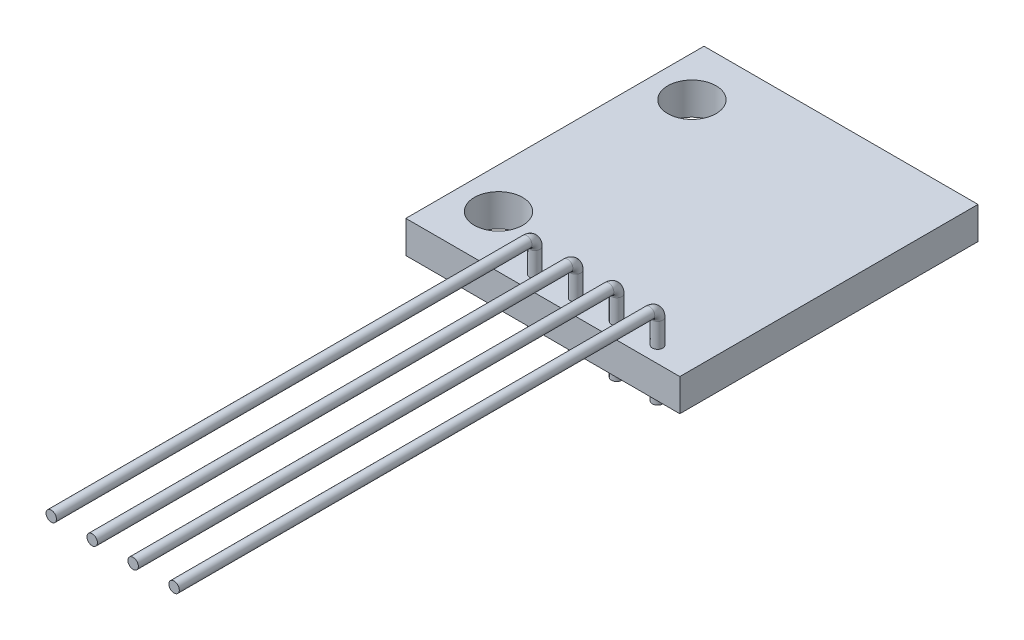
ISO-10303-21;
HEADER;
FILE_DESCRIPTION(('STEP AP214'),'2;1');
FILE_NAME('part.step','',(''),(''),'','','');
FILE_SCHEMA(('AUTOMOTIVE_DESIGN { 1 0 10303 214 1 1 1 1 }'));
ENDSEC;
DATA;
#1=APPLICATION_CONTEXT('core data for automotive mechanical design processes');
#2=APPLICATION_PROTOCOL_DEFINITION('international standard','automotive_design',2000,#1);
#3=PRODUCT_CONTEXT('',#1,'mechanical');
#4=PRODUCT('Part','Part','',(#3));
#5=PRODUCT_RELATED_PRODUCT_CATEGORY('part','',(#4));
#6=PRODUCT_DEFINITION_FORMATION('','',#4);
#7=PRODUCT_DEFINITION_CONTEXT('part definition',#1,'design');
#8=PRODUCT_DEFINITION('design','',#6,#7);
#9=PRODUCT_DEFINITION_SHAPE('','',#8);
#10=(LENGTH_UNIT() NAMED_UNIT(*) SI_UNIT(.MILLI.,.METRE.));
#11=(NAMED_UNIT(*) PLANE_ANGLE_UNIT() SI_UNIT($,.RADIAN.));
#12=(NAMED_UNIT(*) SI_UNIT($,.STERADIAN.) SOLID_ANGLE_UNIT());
#13=UNCERTAINTY_MEASURE_WITH_UNIT(LENGTH_MEASURE(1.E-05),#10,'distance_accuracy_value','');
#14=(GEOMETRIC_REPRESENTATION_CONTEXT(3) GLOBAL_UNCERTAINTY_ASSIGNED_CONTEXT((#13)) GLOBAL_UNIT_ASSIGNED_CONTEXT((#10,
#11,#12)) REPRESENTATION_CONTEXT('',''));
#15=CARTESIAN_POINT('',(0.,0.,0.));
#16=DIRECTION('',(0.,0.,1.));
#17=DIRECTION('',(1.,0.,0.));
#18=AXIS2_PLACEMENT_3D('',#15,#16,#17);
#19=CARTESIAN_POINT('',(0.,2.,0.));
#20=DIRECTION('',(0.,-1.,0.));
#21=DIRECTION('',(0.,0.,-1.));
#22=AXIS2_PLACEMENT_3D('',#19,#20,#21);
#23=PLANE('',#22);
#24=CARTESIAN_POINT('',(14.62,2.,-1.));
#25=DIRECTION('',(0.,-1.,0.));
#26=DIRECTION('',(0.,0.,-1.));
#27=AXIS2_PLACEMENT_3D('',#24,#25,#26);
#28=CIRCLE('',#27,0.325);
#29=CARTESIAN_POINT('',(14.62,2.,-1.325));
#30=VERTEX_POINT('',#29);
#31=EDGE_CURVE('E11',#30,#30,#28,.F.);
#32=ORIENTED_EDGE('',*,*,#31,.F.);
#33=EDGE_LOOP('',(#32));
#34=FACE_BOUND('',#33,.T.);
#35=CARTESIAN_POINT('',(12.08,2.,-1.));
#36=DIRECTION('',(0.,-1.,0.));
#37=DIRECTION('',(0.,0.,-1.));
#38=AXIS2_PLACEMENT_3D('',#35,#36,#37);
#39=CIRCLE('',#38,0.325);
#40=CARTESIAN_POINT('',(12.08,2.,-1.325));
#41=VERTEX_POINT('',#40);
#42=EDGE_CURVE('E43',#41,#41,#39,.F.);
#43=ORIENTED_EDGE('',*,*,#42,.F.);
#44=EDGE_LOOP('',(#43));
#45=FACE_BOUND('',#44,.T.);
#46=CARTESIAN_POINT('',(9.54,2.,-1.));
#47=DIRECTION('',(0.,-1.,0.));
#48=DIRECTION('',(0.,0.,-1.));
#49=AXIS2_PLACEMENT_3D('',#46,#47,#48);
#50=CIRCLE('',#49,0.325);
#51=CARTESIAN_POINT('',(9.54,2.,-1.325));
#52=VERTEX_POINT('',#51);
#53=EDGE_CURVE('E135',#52,#52,#50,.F.);
#54=ORIENTED_EDGE('',*,*,#53,.F.);
#55=EDGE_LOOP('',(#54));
#56=FACE_BOUND('',#55,.T.);
#57=CARTESIAN_POINT('',(7.,2.,-1.));
#58=DIRECTION('',(0.,-1.,0.));
#59=DIRECTION('',(0.,0.,-1.));
#60=AXIS2_PLACEMENT_3D('',#57,#58,#59);
#61=CIRCLE('',#60,0.325);
#62=CARTESIAN_POINT('',(7.,2.,-1.325));
#63=VERTEX_POINT('',#62);
#64=EDGE_CURVE('E150',#63,#63,#61,.F.);
#65=ORIENTED_EDGE('',*,*,#64,.F.);
#66=EDGE_LOOP('',(#65));
#67=FACE_BOUND('',#66,.T.);
#68=DIRECTION('',(0.,0.,1.));
#69=VECTOR('',#68,1.);
#70=CARTESIAN_POINT('',(0.,2.,0.));
#71=LINE('',#70,#69);
#72=CARTESIAN_POINT('',(0.,2.,-18.5));
#73=VERTEX_POINT('',#72);
#74=CARTESIAN_POINT('',(0.,2.,0.));
#75=VERTEX_POINT('',#74);
#76=EDGE_CURVE('E179',#73,#75,#71,.T.);
#77=ORIENTED_EDGE('',*,*,#76,.T.);
#78=DIRECTION('',(1.,0.,0.));
#79=VECTOR('',#78,1.);
#80=CARTESIAN_POINT('',(0.,2.,0.));
#81=LINE('',#80,#79);
#82=CARTESIAN_POINT('',(17.,2.,0.));
#83=VERTEX_POINT('',#82);
#84=EDGE_CURVE('E84',#75,#83,#81,.T.);
#85=ORIENTED_EDGE('',*,*,#84,.T.);
#86=DIRECTION('',(0.,0.,-1.));
#87=VECTOR('',#86,1.);
#88=CARTESIAN_POINT('',(17.,2.,0.));
#89=LINE('',#88,#87);
#90=CARTESIAN_POINT('',(17.,2.,-18.5));
#91=VERTEX_POINT('',#90);
#92=EDGE_CURVE('E182',#83,#91,#89,.T.);
#93=ORIENTED_EDGE('',*,*,#92,.T.);
#94=DIRECTION('',(-1.,0.,0.));
#95=VECTOR('',#94,1.);
#96=CARTESIAN_POINT('',(0.,2.,-18.5));
#97=LINE('',#96,#95);
#98=EDGE_CURVE('E52',#91,#73,#97,.T.);
#99=ORIENTED_EDGE('',*,*,#98,.T.);
#100=EDGE_LOOP('',(#77,#85,#93,#99));
#101=FACE_BOUND('',#100,.T.);
#102=CARTESIAN_POINT('',(2.5,2.,-15.25));
#103=DIRECTION('',(0.,1.,0.));
#104=DIRECTION('',(0.,0.,1.));
#105=AXIS2_PLACEMENT_3D('',#102,#103,#104);
#106=CIRCLE('',#105,1.5);
#107=CARTESIAN_POINT('',(2.5,2.,-13.75));
#108=VERTEX_POINT('',#107);
#109=EDGE_CURVE('E173',#108,#108,#106,.T.);
#110=ORIENTED_EDGE('',*,*,#109,.F.);
#111=EDGE_LOOP('',(#110));
#112=FACE_BOUND('',#111,.T.);
#113=CARTESIAN_POINT('',(2.5,2.,-3.25));
#114=DIRECTION('',(0.,1.,0.));
#115=DIRECTION('',(0.,0.,1.));
#116=AXIS2_PLACEMENT_3D('',#113,#114,#115);
#117=CIRCLE('',#116,1.5);
#118=CARTESIAN_POINT('',(2.5,2.,-1.75));
#119=VERTEX_POINT('',#118);
#120=EDGE_CURVE('E166',#119,#119,#117,.T.);
#121=ORIENTED_EDGE('',*,*,#120,.F.);
#122=EDGE_LOOP('',(#121));
#123=FACE_BOUND('',#122,.T.);
#124=ADVANCED_FACE('F33',(#34,#45,#56,#67,#101,#112,#123),#23,.F.);
#125=CARTESIAN_POINT('',(0.,0.,0.));
#126=DIRECTION('',(0.,-1.,0.));
#127=DIRECTION('',(0.,0.,-1.));
#128=AXIS2_PLACEMENT_3D('',#125,#126,#127);
#129=PLANE('',#128);
#130=CARTESIAN_POINT('',(14.62,0.,-1.));
#131=DIRECTION('',(0.,-1.,0.));
#132=DIRECTION('',(0.,0.,-1.));
#133=AXIS2_PLACEMENT_3D('',#130,#131,#132);
#134=CIRCLE('',#133,0.325);
#135=CARTESIAN_POINT('',(14.62,0.,-1.325));
#136=VERTEX_POINT('',#135);
#137=EDGE_CURVE('E37',#136,#136,#134,.F.);
#138=ORIENTED_EDGE('',*,*,#137,.T.);
#139=EDGE_LOOP('',(#138));
#140=FACE_BOUND('',#139,.T.);
#141=CARTESIAN_POINT('',(12.08,0.,-1.));
#142=DIRECTION('',(0.,-1.,0.));
#143=DIRECTION('',(0.,0.,-1.));
#144=AXIS2_PLACEMENT_3D('',#141,#142,#143);
#145=CIRCLE('',#144,0.325);
#146=CARTESIAN_POINT('',(12.08,0.,-1.325));
#147=VERTEX_POINT('',#146);
#148=EDGE_CURVE('E132',#147,#147,#145,.F.);
#149=ORIENTED_EDGE('',*,*,#148,.T.);
#150=EDGE_LOOP('',(#149));
#151=FACE_BOUND('',#150,.T.);
#152=CARTESIAN_POINT('',(9.54,0.,-1.));
#153=DIRECTION('',(0.,-1.,0.));
#154=DIRECTION('',(0.,0.,-1.));
#155=AXIS2_PLACEMENT_3D('',#152,#153,#154);
#156=CIRCLE('',#155,0.325);
#157=CARTESIAN_POINT('',(9.54,0.,-1.325));
#158=VERTEX_POINT('',#157);
#159=EDGE_CURVE('E147',#158,#158,#156,.F.);
#160=ORIENTED_EDGE('',*,*,#159,.T.);
#161=EDGE_LOOP('',(#160));
#162=FACE_BOUND('',#161,.T.);
#163=CARTESIAN_POINT('',(7.,0.,-1.));
#164=DIRECTION('',(0.,-1.,0.));
#165=DIRECTION('',(0.,0.,-1.));
#166=AXIS2_PLACEMENT_3D('',#163,#164,#165);
#167=CIRCLE('',#166,0.325);
#168=CARTESIAN_POINT('',(7.,0.,-1.325));
#169=VERTEX_POINT('',#168);
#170=EDGE_CURVE('E162',#169,#169,#167,.F.);
#171=ORIENTED_EDGE('',*,*,#170,.T.);
#172=EDGE_LOOP('',(#171));
#173=FACE_BOUND('',#172,.T.);
#174=CARTESIAN_POINT('',(2.5,0.,-15.25));
#175=DIRECTION('',(0.,1.,0.));
#176=DIRECTION('',(0.,0.,1.));
#177=AXIS2_PLACEMENT_3D('',#174,#175,#176);
#178=CIRCLE('',#177,1.5);
#179=CARTESIAN_POINT('',(2.5,0.,-13.75));
#180=VERTEX_POINT('',#179);
#181=EDGE_CURVE('E169',#180,#180,#178,.T.);
#182=ORIENTED_EDGE('',*,*,#181,.T.);
#183=EDGE_LOOP('',(#182));
#184=FACE_BOUND('',#183,.T.);
#185=DIRECTION('',(0.,0.,1.));
#186=VECTOR('',#185,1.);
#187=CARTESIAN_POINT('',(0.,0.,0.));
#188=LINE('',#187,#186);
#189=CARTESIAN_POINT('',(0.,0.,-18.5));
#190=VERTEX_POINT('',#189);
#191=CARTESIAN_POINT('',(0.,0.,0.));
#192=VERTEX_POINT('',#191);
#193=EDGE_CURVE('E176',#190,#192,#188,.T.);
#194=ORIENTED_EDGE('',*,*,#193,.F.);
#195=DIRECTION('',(-1.,0.,0.));
#196=VECTOR('',#195,1.);
#197=CARTESIAN_POINT('',(0.,0.,-18.5));
#198=LINE('',#197,#196);
#199=CARTESIAN_POINT('',(17.,0.,-18.5));
#200=VERTEX_POINT('',#199);
#201=EDGE_CURVE('E76',#200,#190,#198,.T.);
#202=ORIENTED_EDGE('',*,*,#201,.F.);
#203=DIRECTION('',(0.,0.,-1.));
#204=VECTOR('',#203,1.);
#205=CARTESIAN_POINT('',(17.,0.,0.));
#206=LINE('',#205,#204);
#207=CARTESIAN_POINT('',(17.,0.,0.));
#208=VERTEX_POINT('',#207);
#209=EDGE_CURVE('E70',#208,#200,#206,.T.);
#210=ORIENTED_EDGE('',*,*,#209,.F.);
#211=DIRECTION('',(1.,0.,0.));
#212=VECTOR('',#211,1.);
#213=CARTESIAN_POINT('',(0.,0.,0.));
#214=LINE('',#213,#212);
#215=EDGE_CURVE('E188',#192,#208,#214,.T.);
#216=ORIENTED_EDGE('',*,*,#215,.F.);
#217=EDGE_LOOP('',(#194,#202,#210,#216));
#218=FACE_BOUND('',#217,.T.);
#219=CARTESIAN_POINT('',(2.5,0.,-3.25));
#220=DIRECTION('',(0.,1.,0.));
#221=DIRECTION('',(0.,0.,1.));
#222=AXIS2_PLACEMENT_3D('',#219,#220,#221);
#223=CIRCLE('',#222,1.5);
#224=CARTESIAN_POINT('',(2.5,0.,-1.75));
#225=VERTEX_POINT('',#224);
#226=EDGE_CURVE('E170',#225,#225,#223,.T.);
#227=ORIENTED_EDGE('',*,*,#226,.T.);
#228=EDGE_LOOP('',(#227));
#229=FACE_BOUND('',#228,.T.);
#230=ADVANCED_FACE('F204',(#140,#151,#162,#173,#184,#218,#229),#129,.T.);
#231=CARTESIAN_POINT('',(0.,2.,0.));
#232=DIRECTION('',(1.,0.,0.));
#233=DIRECTION('',(0.,0.,-1.));
#234=AXIS2_PLACEMENT_3D('',#231,#232,#233);
#235=PLANE('',#234);
#236=ORIENTED_EDGE('',*,*,#193,.T.);
#237=DIRECTION('',(0.,-1.,0.));
#238=VECTOR('',#237,1.);
#239=CARTESIAN_POINT('',(0.,2.,0.));
#240=LINE('',#239,#238);
#241=EDGE_CURVE('E165',#75,#192,#240,.T.);
#242=ORIENTED_EDGE('',*,*,#241,.F.);
#243=ORIENTED_EDGE('',*,*,#76,.F.);
#244=DIRECTION('',(0.,-1.,0.));
#245=VECTOR('',#244,1.);
#246=CARTESIAN_POINT('',(0.,2.,-18.5));
#247=LINE('',#246,#245);
#248=EDGE_CURVE('E185',#73,#190,#247,.T.);
#249=ORIENTED_EDGE('',*,*,#248,.T.);
#250=EDGE_LOOP('',(#236,#242,#243,#249));
#251=FACE_BOUND('',#250,.T.);
#252=ADVANCED_FACE('F35',(#251),#235,.F.);
#253=CARTESIAN_POINT('',(0.,2.,0.));
#254=DIRECTION('',(0.,0.,-1.));
#255=DIRECTION('',(-1.,0.,0.));
#256=AXIS2_PLACEMENT_3D('',#253,#254,#255);
#257=PLANE('',#256);
#258=ORIENTED_EDGE('',*,*,#215,.T.);
#259=DIRECTION('',(0.,-1.,0.));
#260=VECTOR('',#259,1.);
#261=CARTESIAN_POINT('',(17.,2.,0.));
#262=LINE('',#261,#260);
#263=EDGE_CURVE('E195',#83,#208,#262,.T.);
#264=ORIENTED_EDGE('',*,*,#263,.F.);
#265=ORIENTED_EDGE('',*,*,#84,.F.);
#266=ORIENTED_EDGE('',*,*,#241,.T.);
#267=EDGE_LOOP('',(#258,#264,#265,#266));
#268=FACE_BOUND('',#267,.T.);
#269=ADVANCED_FACE('F249',(#268),#257,.F.);
#270=CARTESIAN_POINT('',(17.,2.,0.));
#271=DIRECTION('',(-1.,0.,0.));
#272=DIRECTION('',(0.,0.,1.));
#273=AXIS2_PLACEMENT_3D('',#270,#271,#272);
#274=PLANE('',#273);
#275=ORIENTED_EDGE('',*,*,#209,.T.);
#276=DIRECTION('',(0.,-1.,0.));
#277=VECTOR('',#276,1.);
#278=CARTESIAN_POINT('',(17.,2.,-18.5));
#279=LINE('',#278,#277);
#280=EDGE_CURVE('E193',#91,#200,#279,.T.);
#281=ORIENTED_EDGE('',*,*,#280,.F.);
#282=ORIENTED_EDGE('',*,*,#92,.F.);
#283=ORIENTED_EDGE('',*,*,#263,.T.);
#284=EDGE_LOOP('',(#275,#281,#282,#283));
#285=FACE_BOUND('',#284,.T.);
#286=ADVANCED_FACE('F247',(#285),#274,.F.);
#287=CARTESIAN_POINT('',(0.,2.,-18.5));
#288=DIRECTION('',(0.,0.,1.));
#289=DIRECTION('',(1.,0.,0.));
#290=AXIS2_PLACEMENT_3D('',#287,#288,#289);
#291=PLANE('',#290);
#292=ORIENTED_EDGE('',*,*,#201,.T.);
#293=ORIENTED_EDGE('',*,*,#248,.F.);
#294=ORIENTED_EDGE('',*,*,#98,.F.);
#295=ORIENTED_EDGE('',*,*,#280,.T.);
#296=EDGE_LOOP('',(#292,#293,#294,#295));
#297=FACE_BOUND('',#296,.T.);
#298=ADVANCED_FACE('F244',(#297),#291,.F.);
#299=CARTESIAN_POINT('',(2.5,2.,-15.25));
#300=DIRECTION('',(0.,-1.,0.));
#301=DIRECTION('',(0.,0.,-1.));
#302=AXIS2_PLACEMENT_3D('',#299,#300,#301);
#303=CYLINDRICAL_SURFACE('',#302,1.5);
#304=ORIENTED_EDGE('',*,*,#109,.T.);
#305=EDGE_LOOP('',(#304));
#306=FACE_BOUND('',#305,.T.);
#307=ORIENTED_EDGE('',*,*,#181,.F.);
#308=EDGE_LOOP('',(#307));
#309=FACE_BOUND('',#308,.T.);
#310=ADVANCED_FACE('F241',(#306,#309),#303,.F.);
#311=CARTESIAN_POINT('',(2.5,2.,-3.25));
#312=DIRECTION('',(0.,-1.,0.));
#313=DIRECTION('',(0.,0.,-1.));
#314=AXIS2_PLACEMENT_3D('',#311,#312,#313);
#315=CYLINDRICAL_SURFACE('',#314,1.5);
#316=ORIENTED_EDGE('',*,*,#120,.T.);
#317=EDGE_LOOP('',(#316));
#318=FACE_BOUND('',#317,.T.);
#319=ORIENTED_EDGE('',*,*,#226,.F.);
#320=EDGE_LOOP('',(#319));
#321=FACE_BOUND('',#320,.T.);
#322=ADVANCED_FACE('F266',(#318,#321),#315,.F.);
#323=CARTESIAN_POINT('',(7.,-1.,-1.));
#324=DIRECTION('',(0.,1.,0.));
#325=DIRECTION('',(0.,0.,1.));
#326=AXIS2_PLACEMENT_3D('',#323,#324,#325);
#327=PLANE('',#326);
#328=CARTESIAN_POINT('',(7.,-1.,-1.));
#329=DIRECTION('',(0.,1.,0.));
#330=DIRECTION('',(0.,0.,1.));
#331=AXIS2_PLACEMENT_3D('',#328,#329,#330);
#332=CIRCLE('',#331,0.325);
#333=CARTESIAN_POINT('',(7.,-1.,-0.675000000000001));
#334=VERTEX_POINT('',#333);
#335=EDGE_CURVE('E160',#334,#334,#332,.T.);
#336=ORIENTED_EDGE('',*,*,#335,.F.);
#337=EDGE_LOOP('',(#336));
#338=FACE_BOUND('',#337,.T.);
#339=ADVANCED_FACE('F269',(#338),#327,.F.);
#340=CARTESIAN_POINT('',(7.,3.5,-1.));
#341=DIRECTION('',(0.,-1.,0.));
#342=DIRECTION('',(0.,0.,-1.));
#343=AXIS2_PLACEMENT_3D('',#340,#341,#342);
#344=CYLINDRICAL_SURFACE('',#343,0.325);
#345=ORIENTED_EDGE('',*,*,#170,.F.);
#346=EDGE_LOOP('',(#345));
#347=FACE_BOUND('',#346,.T.);
#348=ORIENTED_EDGE('',*,*,#335,.T.);
#349=EDGE_LOOP('',(#348));
#350=FACE_BOUND('',#349,.T.);
#351=ADVANCED_FACE('F275',(#347,#350),#344,.T.);
#352=CARTESIAN_POINT('',(7.,3.5,-0.999999999999999));
#353=DIRECTION('',(0.,1.,0.));
#354=DIRECTION('',(0.,0.,1.));
#355=AXIS2_PLACEMENT_3D('',#352,#353,#354);
#356=CIRCLE('',#355,0.325);
#357=CARTESIAN_POINT('',(7.,3.5,-1.325));
#358=VERTEX_POINT('',#357);
#359=EDGE_CURVE('E157',#358,#358,#356,.T.);
#360=ORIENTED_EDGE('',*,*,#359,.F.);
#361=EDGE_LOOP('',(#360));
#362=FACE_BOUND('',#361,.T.);
#363=ORIENTED_EDGE('',*,*,#64,.T.);
#364=EDGE_LOOP('',(#363));
#365=FACE_BOUND('',#364,.T.);
#366=ADVANCED_FACE('F283',(#362,#365),#344,.T.);
#367=CARTESIAN_POINT('',(7.,4.,29.));
#368=DIRECTION('',(0.,0.,1.));
#369=DIRECTION('',(0.,-1.,0.));
#370=AXIS2_PLACEMENT_3D('',#367,#368,#369);
#371=PLANE('',#370);
#372=CARTESIAN_POINT('',(7.,4.,29.));
#373=DIRECTION('',(0.,0.,1.));
#374=DIRECTION('',(0.,-1.,0.));
#375=AXIS2_PLACEMENT_3D('',#372,#373,#374);
#376=CIRCLE('',#375,0.325);
#377=CARTESIAN_POINT('',(7.,3.675,29.));
#378=VERTEX_POINT('',#377);
#379=EDGE_CURVE('E151',#378,#378,#376,.T.);
#380=ORIENTED_EDGE('',*,*,#379,.T.);
#381=EDGE_LOOP('',(#380));
#382=FACE_BOUND('',#381,.T.);
#383=ADVANCED_FACE('F280',(#382),#371,.T.);
#384=CARTESIAN_POINT('',(7.,4.,29.));
#385=DIRECTION('',(0.,0.,-1.));
#386=DIRECTION('',(-1.,0.,0.));
#387=AXIS2_PLACEMENT_3D('',#384,#385,#386);
#388=CYLINDRICAL_SURFACE('',#387,0.325);
#389=CARTESIAN_POINT('',(7.,4.,-0.499999999999997));
#390=DIRECTION('',(0.,0.,1.));
#391=DIRECTION('',(0.,-1.,0.));
#392=AXIS2_PLACEMENT_3D('',#389,#390,#391);
#393=CIRCLE('',#392,0.325);
#394=CARTESIAN_POINT('',(7.,4.325,-0.499999999999995));
#395=VERTEX_POINT('',#394);
#396=EDGE_CURVE('E154',#395,#395,#393,.T.);
#397=ORIENTED_EDGE('',*,*,#396,.T.);
#398=EDGE_LOOP('',(#397));
#399=FACE_BOUND('',#398,.T.);
#400=ORIENTED_EDGE('',*,*,#379,.F.);
#401=EDGE_LOOP('',(#400));
#402=FACE_BOUND('',#401,.T.);
#403=ADVANCED_FACE('F282',(#399,#402),#388,.T.);
#404=CARTESIAN_POINT('',(7.,3.5,-0.500000000000001));
#405=DIRECTION('',(-1.,0.,0.));
#406=DIRECTION('',(0.,0.,1.));
#407=AXIS2_PLACEMENT_3D('',#404,#405,#406);
#408=TOROIDAL_SURFACE('',#407,0.499999999999998,0.325);
#409=CARTESIAN_POINT('',(7.,3.5,-0.500000000000001));
#410=DIRECTION('',(-1.,0.,0.));
#411=DIRECTION('',(0.,0.,1.));
#412=AXIS2_PLACEMENT_3D('',#409,#410,#411);
#413=CIRCLE('',#412,0.824999999999998);
#414=EDGE_CURVE('',#395,#358,#413,.T.);
#415=ORIENTED_EDGE('',*,*,#396,.F.);
#416=ORIENTED_EDGE('',*,*,#359,.T.);
#417=ORIENTED_EDGE('',*,*,#414,.T.);
#418=ORIENTED_EDGE('',*,*,#414,.F.);
#419=EDGE_LOOP('',(#415,#417,#416,#418));
#420=FACE_BOUND('',#419,.T.);
#421=ADVANCED_FACE('F290',(#420),#408,.T.);
#422=CARTESIAN_POINT('',(9.54,-1.,-1.));
#423=DIRECTION('',(0.,1.,0.));
#424=DIRECTION('',(0.,0.,1.));
#425=AXIS2_PLACEMENT_3D('',#422,#423,#424);
#426=PLANE('',#425);
#427=CARTESIAN_POINT('',(9.54,-1.,-1.));
#428=DIRECTION('',(0.,1.,0.));
#429=DIRECTION('',(0.,0.,1.));
#430=AXIS2_PLACEMENT_3D('',#427,#428,#429);
#431=CIRCLE('',#430,0.325);
#432=CARTESIAN_POINT('',(9.54,-1.,-0.675000000000001));
#433=VERTEX_POINT('',#432);
#434=EDGE_CURVE('E145',#433,#433,#431,.T.);
#435=ORIENTED_EDGE('',*,*,#434,.F.);
#436=EDGE_LOOP('',(#435));
#437=FACE_BOUND('',#436,.T.);
#438=ADVANCED_FACE('F285',(#437),#426,.F.);
#439=CARTESIAN_POINT('',(9.54,3.5,-1.));
#440=DIRECTION('',(0.,-1.,0.));
#441=DIRECTION('',(0.,0.,-1.));
#442=AXIS2_PLACEMENT_3D('',#439,#440,#441);
#443=CYLINDRICAL_SURFACE('',#442,0.325);
#444=ORIENTED_EDGE('',*,*,#159,.F.);
#445=EDGE_LOOP('',(#444));
#446=FACE_BOUND('',#445,.T.);
#447=ORIENTED_EDGE('',*,*,#434,.T.);
#448=EDGE_LOOP('',(#447));
#449=FACE_BOUND('',#448,.T.);
#450=ADVANCED_FACE('F299',(#446,#449),#443,.T.);
#451=CARTESIAN_POINT('',(9.54,3.5,-0.999999999999999));
#452=DIRECTION('',(0.,1.,0.));
#453=DIRECTION('',(0.,0.,1.));
#454=AXIS2_PLACEMENT_3D('',#451,#452,#453);
#455=CIRCLE('',#454,0.325);
#456=CARTESIAN_POINT('',(9.54,3.5,-1.325));
#457=VERTEX_POINT('',#456);
#458=EDGE_CURVE('E142',#457,#457,#455,.T.);
#459=ORIENTED_EDGE('',*,*,#458,.F.);
#460=EDGE_LOOP('',(#459));
#461=FACE_BOUND('',#460,.T.);
#462=ORIENTED_EDGE('',*,*,#53,.T.);
#463=EDGE_LOOP('',(#462));
#464=FACE_BOUND('',#463,.T.);
#465=ADVANCED_FACE('F225',(#461,#464),#443,.T.);
#466=CARTESIAN_POINT('',(9.54,4.,29.));
#467=DIRECTION('',(0.,0.,1.));
#468=DIRECTION('',(0.,-1.,0.));
#469=AXIS2_PLACEMENT_3D('',#466,#467,#468);
#470=PLANE('',#469);
#471=CARTESIAN_POINT('',(9.54,4.,29.));
#472=DIRECTION('',(0.,0.,1.));
#473=DIRECTION('',(0.,-1.,0.));
#474=AXIS2_PLACEMENT_3D('',#471,#472,#473);
#475=CIRCLE('',#474,0.325);
#476=CARTESIAN_POINT('',(9.54,3.675,29.));
#477=VERTEX_POINT('',#476);
#478=EDGE_CURVE('E136',#477,#477,#475,.T.);
#479=ORIENTED_EDGE('',*,*,#478,.T.);
#480=EDGE_LOOP('',(#479));
#481=FACE_BOUND('',#480,.T.);
#482=ADVANCED_FACE('F218',(#481),#470,.T.);
#483=CARTESIAN_POINT('',(9.54,4.,29.));
#484=DIRECTION('',(0.,0.,-1.));
#485=DIRECTION('',(-1.,0.,0.));
#486=AXIS2_PLACEMENT_3D('',#483,#484,#485);
#487=CYLINDRICAL_SURFACE('',#486,0.325);
#488=CARTESIAN_POINT('',(9.54,4.,-0.499999999999997));
#489=DIRECTION('',(0.,0.,1.));
#490=DIRECTION('',(0.,-1.,0.));
#491=AXIS2_PLACEMENT_3D('',#488,#489,#490);
#492=CIRCLE('',#491,0.325);
#493=CARTESIAN_POINT('',(9.54,4.325,-0.499999999999995));
#494=VERTEX_POINT('',#493);
#495=EDGE_CURVE('E139',#494,#494,#492,.T.);
#496=ORIENTED_EDGE('',*,*,#495,.T.);
#497=EDGE_LOOP('',(#496));
#498=FACE_BOUND('',#497,.T.);
#499=ORIENTED_EDGE('',*,*,#478,.F.);
#500=EDGE_LOOP('',(#499));
#501=FACE_BOUND('',#500,.T.);
#502=ADVANCED_FACE('F222',(#498,#501),#487,.T.);
#503=CARTESIAN_POINT('',(9.54,3.5,-0.500000000000001));
#504=DIRECTION('',(-1.,0.,0.));
#505=DIRECTION('',(0.,0.,1.));
#506=AXIS2_PLACEMENT_3D('',#503,#504,#505);
#507=TOROIDAL_SURFACE('',#506,0.499999999999998,0.325);
#508=CARTESIAN_POINT('',(9.54,3.5,-0.500000000000001));
#509=DIRECTION('',(-1.,0.,0.));
#510=DIRECTION('',(0.,0.,1.));
#511=AXIS2_PLACEMENT_3D('',#508,#509,#510);
#512=CIRCLE('',#511,0.824999999999998);
#513=EDGE_CURVE('',#494,#457,#512,.T.);
#514=ORIENTED_EDGE('',*,*,#495,.F.);
#515=ORIENTED_EDGE('',*,*,#458,.T.);
#516=ORIENTED_EDGE('',*,*,#513,.T.);
#517=ORIENTED_EDGE('',*,*,#513,.F.);
#518=EDGE_LOOP('',(#514,#516,#515,#517));
#519=FACE_BOUND('',#518,.T.);
#520=ADVANCED_FACE('F216',(#519),#507,.T.);
#521=CARTESIAN_POINT('',(12.08,-1.,-1.));
#522=DIRECTION('',(0.,1.,0.));
#523=DIRECTION('',(0.,0.,1.));
#524=AXIS2_PLACEMENT_3D('',#521,#522,#523);
#525=PLANE('',#524);
#526=CARTESIAN_POINT('',(12.08,-1.,-1.));
#527=DIRECTION('',(0.,1.,0.));
#528=DIRECTION('',(0.,0.,1.));
#529=AXIS2_PLACEMENT_3D('',#526,#527,#528);
#530=CIRCLE('',#529,0.325);
#531=CARTESIAN_POINT('',(12.08,-1.,-0.675000000000001));
#532=VERTEX_POINT('',#531);
#533=EDGE_CURVE('E130',#532,#532,#530,.T.);
#534=ORIENTED_EDGE('',*,*,#533,.F.);
#535=EDGE_LOOP('',(#534));
#536=FACE_BOUND('',#535,.T.);
#537=ADVANCED_FACE('F211',(#536),#525,.F.);
#538=CARTESIAN_POINT('',(12.08,3.5,-1.));
#539=DIRECTION('',(0.,-1.,0.));
#540=DIRECTION('',(0.,0.,-1.));
#541=AXIS2_PLACEMENT_3D('',#538,#539,#540);
#542=CYLINDRICAL_SURFACE('',#541,0.325);
#543=ORIENTED_EDGE('',*,*,#148,.F.);
#544=EDGE_LOOP('',(#543));
#545=FACE_BOUND('',#544,.T.);
#546=ORIENTED_EDGE('',*,*,#533,.T.);
#547=EDGE_LOOP('',(#546));
#548=FACE_BOUND('',#547,.T.);
#549=ADVANCED_FACE('F207',(#545,#548),#542,.T.);
#550=CARTESIAN_POINT('',(12.08,3.5,-0.999999999999999));
#551=DIRECTION('',(0.,1.,0.));
#552=DIRECTION('',(0.,0.,1.));
#553=AXIS2_PLACEMENT_3D('',#550,#551,#552);
#554=CIRCLE('',#553,0.325);
#555=CARTESIAN_POINT('',(12.08,3.5,-1.325));
#556=VERTEX_POINT('',#555);
#557=EDGE_CURVE('E127',#556,#556,#554,.T.);
#558=ORIENTED_EDGE('',*,*,#557,.F.);
#559=EDGE_LOOP('',(#558));
#560=FACE_BOUND('',#559,.T.);
#561=ORIENTED_EDGE('',*,*,#42,.T.);
#562=EDGE_LOOP('',(#561));
#563=FACE_BOUND('',#562,.T.);
#564=ADVANCED_FACE('F210',(#560,#563),#542,.T.);
#565=CARTESIAN_POINT('',(12.08,4.,29.));
#566=DIRECTION('',(0.,0.,1.));
#567=DIRECTION('',(0.,-1.,0.));
#568=AXIS2_PLACEMENT_3D('',#565,#566,#567);
#569=PLANE('',#568);
#570=CARTESIAN_POINT('',(12.08,4.,29.));
#571=DIRECTION('',(0.,0.,1.));
#572=DIRECTION('',(0.,-1.,0.));
#573=AXIS2_PLACEMENT_3D('',#570,#571,#572);
#574=CIRCLE('',#573,0.325);
#575=CARTESIAN_POINT('',(12.08,3.675,29.));
#576=VERTEX_POINT('',#575);
#577=EDGE_CURVE('E116',#576,#576,#574,.T.);
#578=ORIENTED_EDGE('',*,*,#577,.T.);
#579=EDGE_LOOP('',(#578));
#580=FACE_BOUND('',#579,.T.);
#581=ADVANCED_FACE('F306',(#580),#569,.T.);
#582=CARTESIAN_POINT('',(12.08,4.,29.));
#583=DIRECTION('',(0.,0.,-1.));
#584=DIRECTION('',(-1.,0.,0.));
#585=AXIS2_PLACEMENT_3D('',#582,#583,#584);
#586=CYLINDRICAL_SURFACE('',#585,0.325);
#587=CARTESIAN_POINT('',(12.08,4.,-0.499999999999997));
#588=DIRECTION('',(0.,0.,1.));
#589=DIRECTION('',(0.,-1.,0.));
#590=AXIS2_PLACEMENT_3D('',#587,#588,#589);
#591=CIRCLE('',#590,0.325);
#592=CARTESIAN_POINT('',(12.08,4.325,-0.499999999999995));
#593=VERTEX_POINT('',#592);
#594=EDGE_CURVE('E124',#593,#593,#591,.T.);
#595=ORIENTED_EDGE('',*,*,#594,.T.);
#596=EDGE_LOOP('',(#595));
#597=FACE_BOUND('',#596,.T.);
#598=ORIENTED_EDGE('',*,*,#577,.F.);
#599=EDGE_LOOP('',(#598));
#600=FACE_BOUND('',#599,.T.);
#601=ADVANCED_FACE('F308',(#597,#600),#586,.T.);
#602=CARTESIAN_POINT('',(12.08,3.5,-0.500000000000001));
#603=DIRECTION('',(-1.,0.,0.));
#604=DIRECTION('',(0.,0.,1.));
#605=AXIS2_PLACEMENT_3D('',#602,#603,#604);
#606=TOROIDAL_SURFACE('',#605,0.499999999999998,0.325);
#607=CARTESIAN_POINT('',(12.08,3.5,-0.500000000000001));
#608=DIRECTION('',(-1.,0.,0.));
#609=DIRECTION('',(0.,0.,1.));
#610=AXIS2_PLACEMENT_3D('',#607,#608,#609);
#611=CIRCLE('',#610,0.824999999999998);
#612=EDGE_CURVE('',#593,#556,#611,.T.);
#613=ORIENTED_EDGE('',*,*,#594,.F.);
#614=ORIENTED_EDGE('',*,*,#557,.T.);
#615=ORIENTED_EDGE('',*,*,#612,.T.);
#616=ORIENTED_EDGE('',*,*,#612,.F.);
#617=EDGE_LOOP('',(#613,#615,#614,#616));
#618=FACE_BOUND('',#617,.T.);
#619=ADVANCED_FACE('F315',(#618),#606,.T.);
#620=CARTESIAN_POINT('',(14.62,-1.,-1.));
#621=DIRECTION('',(0.,1.,0.));
#622=DIRECTION('',(0.,0.,1.));
#623=AXIS2_PLACEMENT_3D('',#620,#621,#622);
#624=PLANE('',#623);
#625=CARTESIAN_POINT('',(14.62,-1.,-1.));
#626=DIRECTION('',(0.,1.,0.));
#627=DIRECTION('',(0.,0.,1.));
#628=AXIS2_PLACEMENT_3D('',#625,#626,#627);
#629=CIRCLE('',#628,0.325);
#630=CARTESIAN_POINT('',(14.62,-1.,-0.675000000000001));
#631=VERTEX_POINT('',#630);
#632=EDGE_CURVE('E110',#631,#631,#629,.T.);
#633=ORIENTED_EDGE('',*,*,#632,.F.);
#634=EDGE_LOOP('',(#633));
#635=FACE_BOUND('',#634,.T.);
#636=ADVANCED_FACE('F310',(#635),#624,.F.);
#637=CARTESIAN_POINT('',(14.62,3.5,-1.));
#638=DIRECTION('',(0.,-1.,0.));
#639=DIRECTION('',(0.,0.,-1.));
#640=AXIS2_PLACEMENT_3D('',#637,#638,#639);
#641=CYLINDRICAL_SURFACE('',#640,0.325);
#642=ORIENTED_EDGE('',*,*,#137,.F.);
#643=EDGE_LOOP('',(#642));
#644=FACE_BOUND('',#643,.T.);
#645=ORIENTED_EDGE('',*,*,#632,.T.);
#646=EDGE_LOOP('',(#645));
#647=FACE_BOUND('',#646,.T.);
#648=ADVANCED_FACE('F111',(#644,#647),#641,.T.);
#649=CARTESIAN_POINT('',(14.62,3.5,-0.999999999999999));
#650=DIRECTION('',(0.,1.,0.));
#651=DIRECTION('',(0.,0.,1.));
#652=AXIS2_PLACEMENT_3D('',#649,#650,#651);
#653=CIRCLE('',#652,0.325);
#654=CARTESIAN_POINT('',(14.62,3.5,-1.325));
#655=VERTEX_POINT('',#654);
#656=EDGE_CURVE('E113',#655,#655,#653,.T.);
#657=ORIENTED_EDGE('',*,*,#656,.F.);
#658=EDGE_LOOP('',(#657));
#659=FACE_BOUND('',#658,.T.);
#660=ORIENTED_EDGE('',*,*,#31,.T.);
#661=EDGE_LOOP('',(#660));
#662=FACE_BOUND('',#661,.T.);
#663=ADVANCED_FACE('F325',(#659,#662),#641,.T.);
#664=CARTESIAN_POINT('',(14.62,4.,29.));
#665=DIRECTION('',(0.,0.,1.));
#666=DIRECTION('',(0.,-1.,0.));
#667=AXIS2_PLACEMENT_3D('',#664,#665,#666);
#668=PLANE('',#667);
#669=CARTESIAN_POINT('',(14.62,4.,29.));
#670=DIRECTION('',(0.,0.,1.));
#671=DIRECTION('',(0.,-1.,0.));
#672=AXIS2_PLACEMENT_3D('',#669,#670,#671);
#673=CIRCLE('',#672,0.325);
#674=CARTESIAN_POINT('',(14.62,3.675,29.));
#675=VERTEX_POINT('',#674);
#676=EDGE_CURVE('E345',#675,#675,#673,.T.);
#677=ORIENTED_EDGE('',*,*,#676,.T.);
#678=EDGE_LOOP('',(#677));
#679=FACE_BOUND('',#678,.T.);
#680=ADVANCED_FACE('F332',(#679),#668,.T.);
#681=CARTESIAN_POINT('',(14.62,4.,29.));
#682=DIRECTION('',(0.,0.,-1.));
#683=DIRECTION('',(-1.,0.,0.));
#684=AXIS2_PLACEMENT_3D('',#681,#682,#683);
#685=CYLINDRICAL_SURFACE('',#684,0.325);
#686=CARTESIAN_POINT('',(14.62,4.,-0.499999999999997));
#687=DIRECTION('',(0.,0.,1.));
#688=DIRECTION('',(0.,-1.,0.));
#689=AXIS2_PLACEMENT_3D('',#686,#687,#688);
#690=CIRCLE('',#689,0.325);
#691=CARTESIAN_POINT('',(14.62,4.325,-0.499999999999995));
#692=VERTEX_POINT('',#691);
#693=EDGE_CURVE('E118',#692,#692,#690,.T.);
#694=ORIENTED_EDGE('',*,*,#693,.T.);
#695=EDGE_LOOP('',(#694));
#696=FACE_BOUND('',#695,.T.);
#697=ORIENTED_EDGE('',*,*,#676,.F.);
#698=EDGE_LOOP('',(#697));
#699=FACE_BOUND('',#698,.T.);
#700=ADVANCED_FACE('F334',(#696,#699),#685,.T.);
#701=CARTESIAN_POINT('',(14.62,3.5,-0.500000000000001));
#702=DIRECTION('',(-1.,0.,0.));
#703=DIRECTION('',(0.,0.,1.));
#704=AXIS2_PLACEMENT_3D('',#701,#702,#703);
#705=TOROIDAL_SURFACE('',#704,0.499999999999998,0.325);
#706=CARTESIAN_POINT('',(14.62,3.5,-0.500000000000001));
#707=DIRECTION('',(-1.,0.,0.));
#708=DIRECTION('',(0.,0.,1.));
#709=AXIS2_PLACEMENT_3D('',#706,#707,#708);
#710=CIRCLE('',#709,0.824999999999998);
#711=EDGE_CURVE('',#692,#655,#710,.T.);
#712=ORIENTED_EDGE('',*,*,#693,.F.);
#713=ORIENTED_EDGE('',*,*,#656,.T.);
#714=ORIENTED_EDGE('',*,*,#711,.T.);
#715=ORIENTED_EDGE('',*,*,#711,.F.);
#716=EDGE_LOOP('',(#712,#714,#713,#715));
#717=FACE_BOUND('',#716,.T.);
#718=ADVANCED_FACE('F340',(#717),#705,.T.);
#719=CLOSED_SHELL('',(#124,#230,#252,#269,#286,#298,#310,#322,#339,#351,#366,#383,#403,#421,
#438,#450,#465,#482,#502,#520,#537,#549,#564,#581,#601,#619,#636,#648,#663,#680,#700,#718));
#720=MANIFOLD_SOLID_BREP('B2',#719);
#721=ADVANCED_BREP_SHAPE_REPRESENTATION('',(#18,#720),#14);
#722=SHAPE_DEFINITION_REPRESENTATION(#9,#721);
ENDSEC;
END-ISO-10303-21;
